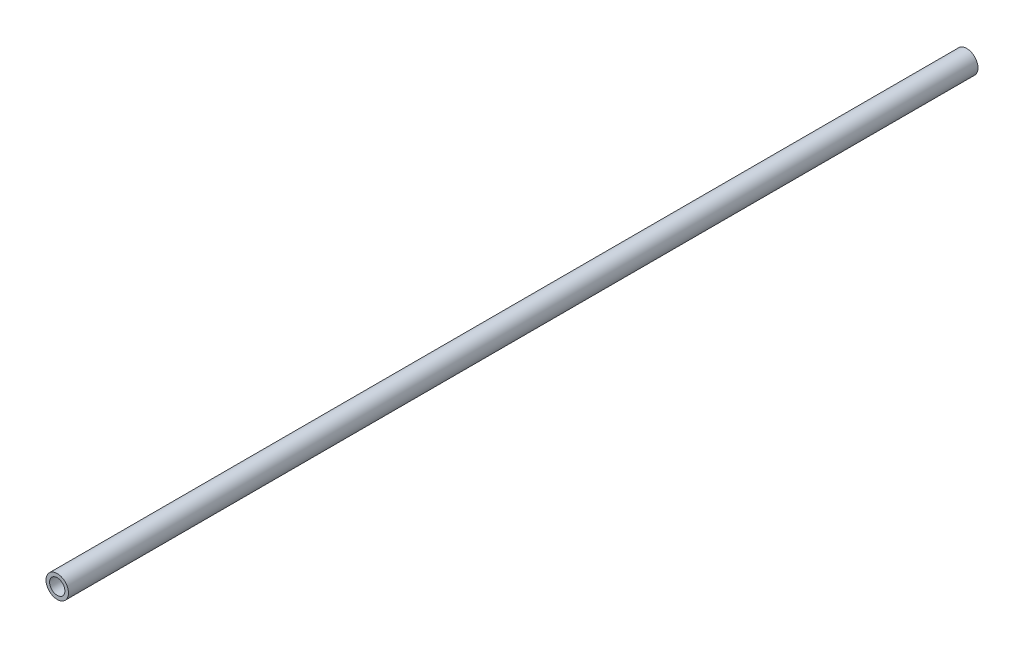
ISO-10303-21;
HEADER;
FILE_DESCRIPTION(('STEP AP214'),'2;1');
FILE_NAME('part.step','',(''),(''),'','','');
FILE_SCHEMA(('AUTOMOTIVE_DESIGN { 1 0 10303 214 1 1 1 1 }'));
ENDSEC;
DATA;
#1=APPLICATION_CONTEXT('core data for automotive mechanical design processes');
#2=APPLICATION_PROTOCOL_DEFINITION('international standard','automotive_design',2000,#1);
#3=PRODUCT_CONTEXT('',#1,'mechanical');
#4=PRODUCT('Part','Part','',(#3));
#5=PRODUCT_RELATED_PRODUCT_CATEGORY('part','',(#4));
#6=PRODUCT_DEFINITION_FORMATION('','',#4);
#7=PRODUCT_DEFINITION_CONTEXT('part definition',#1,'design');
#8=PRODUCT_DEFINITION('design','',#6,#7);
#9=PRODUCT_DEFINITION_SHAPE('','',#8);
#10=(LENGTH_UNIT() NAMED_UNIT(*) SI_UNIT(.MILLI.,.METRE.));
#11=(NAMED_UNIT(*) PLANE_ANGLE_UNIT() SI_UNIT($,.RADIAN.));
#12=(NAMED_UNIT(*) SI_UNIT($,.STERADIAN.) SOLID_ANGLE_UNIT());
#13=UNCERTAINTY_MEASURE_WITH_UNIT(LENGTH_MEASURE(1.E-05),#10,'distance_accuracy_value','');
#14=(GEOMETRIC_REPRESENTATION_CONTEXT(3) GLOBAL_UNCERTAINTY_ASSIGNED_CONTEXT((#13)) GLOBAL_UNIT_ASSIGNED_CONTEXT((#10,
#11,#12)) REPRESENTATION_CONTEXT('',''));
#15=CARTESIAN_POINT('',(0.,0.,0.));
#16=DIRECTION('',(0.,0.,1.));
#17=DIRECTION('',(1.,0.,0.));
#18=AXIS2_PLACEMENT_3D('',#15,#16,#17);
#19=CARTESIAN_POINT('',(0.,0.,-202.));
#20=DIRECTION('',(0.,0.,1.));
#21=DIRECTION('',(1.,0.,0.));
#22=AXIS2_PLACEMENT_3D('',#19,#20,#21);
#23=CYLINDRICAL_SURFACE('',#22,2.5);
#24=CARTESIAN_POINT('',(0.,0.,-202.));
#25=DIRECTION('',(0.,0.,1.));
#26=DIRECTION('',(1.,0.,0.));
#27=AXIS2_PLACEMENT_3D('',#24,#25,#26);
#28=CIRCLE('',#27,2.5);
#29=CARTESIAN_POINT('',(2.5,0.,-202.));
#30=VERTEX_POINT('',#29);
#31=EDGE_CURVE('E11',#30,#30,#28,.T.);
#32=ORIENTED_EDGE('',*,*,#31,.T.);
#33=EDGE_LOOP('',(#32));
#34=FACE_BOUND('',#33,.T.);
#35=CARTESIAN_POINT('',(0.,0.,0.));
#36=DIRECTION('',(0.,0.,1.));
#37=DIRECTION('',(1.,0.,0.));
#38=AXIS2_PLACEMENT_3D('',#35,#36,#37);
#39=CIRCLE('',#38,2.5);
#40=CARTESIAN_POINT('',(2.5,0.,0.));
#41=VERTEX_POINT('',#40);
#42=EDGE_CURVE('E36',#41,#41,#39,.T.);
#43=ORIENTED_EDGE('',*,*,#42,.F.);
#44=EDGE_LOOP('',(#43));
#45=FACE_BOUND('',#44,.T.);
#46=ADVANCED_FACE('F33',(#34,#45),#23,.T.);
#47=CARTESIAN_POINT('',(0.,0.,-202.));
#48=DIRECTION('',(0.,0.,1.));
#49=DIRECTION('',(1.,0.,0.));
#50=AXIS2_PLACEMENT_3D('',#47,#48,#49);
#51=PLANE('',#50);
#52=CARTESIAN_POINT('',(0.,0.,-202.));
#53=DIRECTION('',(0.,0.,-1.));
#54=DIRECTION('',(-1.,0.,0.));
#55=AXIS2_PLACEMENT_3D('',#52,#53,#54);
#56=CIRCLE('',#55,1.69999999999999);
#57=CARTESIAN_POINT('',(-1.69999999999999,0.,-202.));
#58=VERTEX_POINT('',#57);
#59=EDGE_CURVE('E57',#58,#58,#56,.T.);
#60=ORIENTED_EDGE('',*,*,#59,.F.);
#61=EDGE_LOOP('',(#60));
#62=FACE_BOUND('',#61,.T.);
#63=ORIENTED_EDGE('',*,*,#31,.F.);
#64=EDGE_LOOP('',(#63));
#65=FACE_BOUND('',#64,.T.);
#66=ADVANCED_FACE('F74',(#62,#65),#51,.F.);
#67=CARTESIAN_POINT('',(0.,0.,0.));
#68=DIRECTION('',(0.,0.,1.));
#69=DIRECTION('',(1.,0.,0.));
#70=AXIS2_PLACEMENT_3D('',#67,#68,#69);
#71=PLANE('',#70);
#72=CARTESIAN_POINT('',(0.,0.,0.));
#73=DIRECTION('',(0.,0.,1.));
#74=DIRECTION('',(1.,0.,0.));
#75=AXIS2_PLACEMENT_3D('',#72,#73,#74);
#76=CIRCLE('',#75,1.69999999999999);
#77=CARTESIAN_POINT('',(1.69999999999999,0.,0.));
#78=VERTEX_POINT('',#77);
#79=EDGE_CURVE('E56',#78,#78,#76,.T.);
#80=ORIENTED_EDGE('',*,*,#79,.F.);
#81=EDGE_LOOP('',(#80));
#82=FACE_BOUND('',#81,.T.);
#83=ORIENTED_EDGE('',*,*,#42,.T.);
#84=EDGE_LOOP('',(#83));
#85=FACE_BOUND('',#84,.T.);
#86=ADVANCED_FACE('F71',(#82,#85),#71,.T.);
#87=CARTESIAN_POINT('',(0.,0.,-9.97853694765315));
#88=DIRECTION('',(0.,0.,1.));
#89=DIRECTION('',(1.,0.,0.));
#90=AXIS2_PLACEMENT_3D('',#87,#88,#89);
#91=CONICAL_SURFACE('',#90,1.7,1.02974425867665);
#92=CARTESIAN_POINT('',(0.,0.,-11.));
#93=VERTEX_POINT('',#92);
#94=VERTEX_LOOP('',#93);
#95=FACE_BOUND('',#94,.T.);
#96=CARTESIAN_POINT('',(0.,0.,-9.97853694765315));
#97=DIRECTION('',(0.,0.,1.));
#98=DIRECTION('',(1.,0.,0.));
#99=AXIS2_PLACEMENT_3D('',#96,#97,#98);
#100=CIRCLE('',#99,1.7);
#101=CARTESIAN_POINT('',(1.7,0.,-9.97853694765315));
#102=VERTEX_POINT('',#101);
#103=EDGE_CURVE('E60',#102,#102,#100,.T.);
#104=ORIENTED_EDGE('',*,*,#103,.T.);
#105=EDGE_LOOP('',(#104));
#106=FACE_BOUND('',#105,.T.);
#107=ADVANCED_FACE('F86',(#95,#106),#91,.F.);
#108=CARTESIAN_POINT('',(0.,0.,0.));
#109=DIRECTION('',(0.,0.,1.));
#110=DIRECTION('',(1.,0.,0.));
#111=AXIS2_PLACEMENT_3D('',#108,#109,#110);
#112=CYLINDRICAL_SURFACE('',#111,1.69999999999999);
#113=ORIENTED_EDGE('',*,*,#103,.F.);
#114=EDGE_LOOP('',(#113));
#115=FACE_BOUND('',#114,.T.);
#116=ORIENTED_EDGE('',*,*,#79,.T.);
#117=EDGE_LOOP('',(#116));
#118=FACE_BOUND('',#117,.T.);
#119=ADVANCED_FACE('F50',(#115,#118),#112,.F.);
#120=CARTESIAN_POINT('',(0.,0.,-192.021463052347));
#121=DIRECTION('',(0.,0.,-1.));
#122=DIRECTION('',(-1.,0.,0.));
#123=AXIS2_PLACEMENT_3D('',#120,#121,#122);
#124=CONICAL_SURFACE('',#123,1.7,1.02974425867665);
#125=CARTESIAN_POINT('',(0.,0.,-191.));
#126=VERTEX_POINT('',#125);
#127=VERTEX_LOOP('',#126);
#128=FACE_BOUND('',#127,.T.);
#129=CARTESIAN_POINT('',(0.,0.,-192.021463052347));
#130=DIRECTION('',(0.,0.,-1.));
#131=DIRECTION('',(-1.,0.,0.));
#132=AXIS2_PLACEMENT_3D('',#129,#130,#131);
#133=CIRCLE('',#132,1.7);
#134=CARTESIAN_POINT('',(-1.7,0.,-192.021463052347));
#135=VERTEX_POINT('',#134);
#136=EDGE_CURVE('E54',#135,#135,#133,.T.);
#137=ORIENTED_EDGE('',*,*,#136,.T.);
#138=EDGE_LOOP('',(#137));
#139=FACE_BOUND('',#138,.T.);
#140=ADVANCED_FACE('F46',(#128,#139),#124,.F.);
#141=CARTESIAN_POINT('',(0.,0.,-202.));
#142=DIRECTION('',(0.,0.,-1.));
#143=DIRECTION('',(-1.,0.,0.));
#144=AXIS2_PLACEMENT_3D('',#141,#142,#143);
#145=CYLINDRICAL_SURFACE('',#144,1.69999999999999);
#146=ORIENTED_EDGE('',*,*,#136,.F.);
#147=EDGE_LOOP('',(#146));
#148=FACE_BOUND('',#147,.T.);
#149=ORIENTED_EDGE('',*,*,#59,.T.);
#150=EDGE_LOOP('',(#149));
#151=FACE_BOUND('',#150,.T.);
#152=ADVANCED_FACE('F49',(#148,#151),#145,.F.);
#153=CLOSED_SHELL('',(#46,#66,#86,#107,#119,#140,#152));
#154=MANIFOLD_SOLID_BREP('B2',#153);
#155=ADVANCED_BREP_SHAPE_REPRESENTATION('',(#18,#154),#14);
#156=SHAPE_DEFINITION_REPRESENTATION(#9,#155);
ENDSEC;
END-ISO-10303-21;
